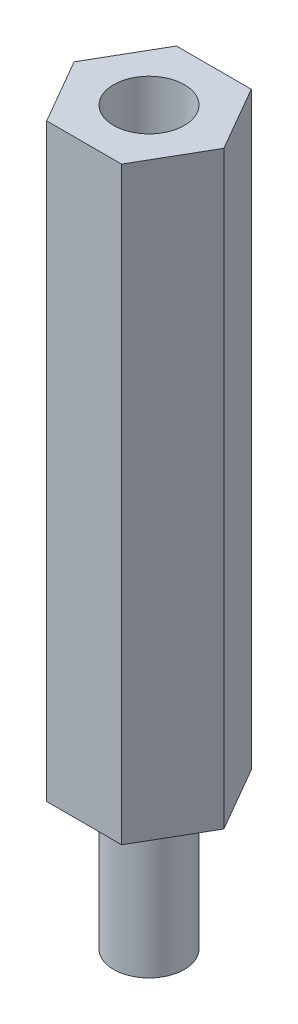
ISO-10303-21;
HEADER;
FILE_DESCRIPTION(('STEP AP214'),'2;1');
FILE_NAME('part.step','',(''),(''),'','','');
FILE_SCHEMA(('AUTOMOTIVE_DESIGN { 1 0 10303 214 1 1 1 1 }'));
ENDSEC;
DATA;
#1=APPLICATION_CONTEXT('core data for automotive mechanical design processes');
#2=APPLICATION_PROTOCOL_DEFINITION('international standard','automotive_design',2000,#1);
#3=PRODUCT_CONTEXT('',#1,'mechanical');
#4=PRODUCT('Part','Part','',(#3));
#5=PRODUCT_RELATED_PRODUCT_CATEGORY('part','',(#4));
#6=PRODUCT_DEFINITION_FORMATION('','',#4);
#7=PRODUCT_DEFINITION_CONTEXT('part definition',#1,'design');
#8=PRODUCT_DEFINITION('design','',#6,#7);
#9=PRODUCT_DEFINITION_SHAPE('','',#8);
#10=(LENGTH_UNIT() NAMED_UNIT(*) SI_UNIT(.MILLI.,.METRE.));
#11=(NAMED_UNIT(*) PLANE_ANGLE_UNIT() SI_UNIT($,.RADIAN.));
#12=(NAMED_UNIT(*) SI_UNIT($,.STERADIAN.) SOLID_ANGLE_UNIT());
#13=UNCERTAINTY_MEASURE_WITH_UNIT(LENGTH_MEASURE(1.E-05),#10,'distance_accuracy_value','');
#14=(GEOMETRIC_REPRESENTATION_CONTEXT(3) GLOBAL_UNCERTAINTY_ASSIGNED_CONTEXT((#13)) GLOBAL_UNIT_ASSIGNED_CONTEXT((#10,
#11,#12)) REPRESENTATION_CONTEXT('',''));
#15=CARTESIAN_POINT('',(0.,0.,0.));
#16=DIRECTION('',(0.,0.,1.));
#17=DIRECTION('',(1.,0.,0.));
#18=AXIS2_PLACEMENT_3D('',#15,#16,#17);
#19=CARTESIAN_POINT('',(1.58771324027146,25.,2.75000000000002));
#20=DIRECTION('',(-0.866025403784438,0.,-0.500000000000001));
#21=DIRECTION('',(-0.500000000000001,0.,0.866025403784438));
#22=AXIS2_PLACEMENT_3D('',#19,#20,#21);
#23=PLANE('',#22);
#24=DIRECTION('',(0.500000000000001,0.,-0.866025403784438));
#25=VECTOR('',#24,1.);
#26=CARTESIAN_POINT('',(1.58771324027146,0.,2.75000000000002));
#27=LINE('',#26,#25);
#28=CARTESIAN_POINT('',(1.58771324027146,0.,2.75000000000002));
#29=VERTEX_POINT('',#28);
#30=CARTESIAN_POINT('',(3.17542648054294,0.,0.));
#31=VERTEX_POINT('',#30);
#32=EDGE_CURVE('E136',#29,#31,#27,.T.);
#33=ORIENTED_EDGE('',*,*,#32,.T.);
#34=DIRECTION('',(0.,-1.,0.));
#35=VECTOR('',#34,1.);
#36=CARTESIAN_POINT('',(3.17542648054294,25.,0.));
#37=LINE('',#36,#35);
#38=CARTESIAN_POINT('',(3.17542648054294,25.,0.));
#39=VERTEX_POINT('',#38);
#40=EDGE_CURVE('E48',#39,#31,#37,.T.);
#41=ORIENTED_EDGE('',*,*,#40,.F.);
#42=DIRECTION('',(0.500000000000001,0.,-0.866025403784438));
#43=VECTOR('',#42,1.);
#44=CARTESIAN_POINT('',(1.58771324027146,25.,2.75000000000002));
#45=LINE('',#44,#43);
#46=CARTESIAN_POINT('',(1.58771324027146,25.,2.75000000000002));
#47=VERTEX_POINT('',#46);
#48=EDGE_CURVE('E153',#47,#39,#45,.T.);
#49=ORIENTED_EDGE('',*,*,#48,.F.);
#50=DIRECTION('',(0.,-1.,0.));
#51=VECTOR('',#50,1.);
#52=CARTESIAN_POINT('',(1.58771324027146,25.,2.75000000000002));
#53=LINE('',#52,#51);
#54=EDGE_CURVE('E132',#47,#29,#53,.T.);
#55=ORIENTED_EDGE('',*,*,#54,.T.);
#56=EDGE_LOOP('',(#33,#41,#49,#55));
#57=FACE_BOUND('',#56,.T.);
#58=ADVANCED_FACE('F45',(#57),#23,.F.);
#59=CARTESIAN_POINT('',(3.17542648054294,25.,0.));
#60=DIRECTION('',(-0.866025403784439,0.,0.5));
#61=DIRECTION('',(0.5,0.,0.866025403784439));
#62=AXIS2_PLACEMENT_3D('',#59,#60,#61);
#63=PLANE('',#62);
#64=DIRECTION('',(-0.5,0.,-0.866025403784439));
#65=VECTOR('',#64,1.);
#66=CARTESIAN_POINT('',(3.17542648054294,0.,0.));
#67=LINE('',#66,#65);
#68=CARTESIAN_POINT('',(1.58771324027146,0.,-2.75000000000002));
#69=VERTEX_POINT('',#68);
#70=EDGE_CURVE('E140',#31,#69,#67,.T.);
#71=ORIENTED_EDGE('',*,*,#70,.T.);
#72=DIRECTION('',(0.,-1.,0.));
#73=VECTOR('',#72,1.);
#74=CARTESIAN_POINT('',(1.58771324027146,25.,-2.75000000000002));
#75=LINE('',#74,#73);
#76=CARTESIAN_POINT('',(1.58771324027146,25.,-2.75000000000002));
#77=VERTEX_POINT('',#76);
#78=EDGE_CURVE('E159',#77,#69,#75,.T.);
#79=ORIENTED_EDGE('',*,*,#78,.F.);
#80=DIRECTION('',(-0.5,0.,-0.866025403784439));
#81=VECTOR('',#80,1.);
#82=CARTESIAN_POINT('',(3.17542648054294,25.,0.));
#83=LINE('',#82,#81);
#84=EDGE_CURVE('E101',#39,#77,#83,.T.);
#85=ORIENTED_EDGE('',*,*,#84,.F.);
#86=ORIENTED_EDGE('',*,*,#40,.T.);
#87=EDGE_LOOP('',(#71,#79,#85,#86));
#88=FACE_BOUND('',#87,.T.);
#89=ADVANCED_FACE('F166',(#88),#63,.F.);
#90=CARTESIAN_POINT('',(1.58771324027146,25.,-2.75000000000002));
#91=DIRECTION('',(0.,0.,1.));
#92=DIRECTION('',(1.,0.,0.));
#93=AXIS2_PLACEMENT_3D('',#90,#91,#92);
#94=PLANE('',#93);
#95=DIRECTION('',(-1.,0.,0.));
#96=VECTOR('',#95,1.);
#97=CARTESIAN_POINT('',(1.58771324027146,0.,-2.75000000000002));
#98=LINE('',#97,#96);
#99=CARTESIAN_POINT('',(-1.58771324027148,0.,-2.75000000000002));
#100=VERTEX_POINT('',#99);
#101=EDGE_CURVE('E144',#69,#100,#98,.T.);
#102=ORIENTED_EDGE('',*,*,#101,.T.);
#103=DIRECTION('',(0.,-1.,0.));
#104=VECTOR('',#103,1.);
#105=CARTESIAN_POINT('',(-1.58771324027148,25.,-2.75000000000002));
#106=LINE('',#105,#104);
#107=CARTESIAN_POINT('',(-1.58771324027148,25.,-2.75000000000002));
#108=VERTEX_POINT('',#107);
#109=EDGE_CURVE('E125',#108,#100,#106,.T.);
#110=ORIENTED_EDGE('',*,*,#109,.F.);
#111=DIRECTION('',(-1.,0.,0.));
#112=VECTOR('',#111,1.);
#113=CARTESIAN_POINT('',(1.58771324027146,25.,-2.75000000000002));
#114=LINE('',#113,#112);
#115=EDGE_CURVE('E114',#77,#108,#114,.T.);
#116=ORIENTED_EDGE('',*,*,#115,.F.);
#117=ORIENTED_EDGE('',*,*,#78,.T.);
#118=EDGE_LOOP('',(#102,#110,#116,#117));
#119=FACE_BOUND('',#118,.T.);
#120=ADVANCED_FACE('F172',(#119),#94,.F.);
#121=CARTESIAN_POINT('',(-1.58771324027148,25.,-2.75000000000002));
#122=DIRECTION('',(0.866025403784439,0.,0.499999999999999));
#123=DIRECTION('',(0.499999999999999,0.,-0.866025403784439));
#124=AXIS2_PLACEMENT_3D('',#121,#122,#123);
#125=PLANE('',#124);
#126=DIRECTION('',(-0.499999999999999,0.,0.866025403784439));
#127=VECTOR('',#126,1.);
#128=CARTESIAN_POINT('',(-1.58771324027148,0.,-2.75000000000002));
#129=LINE('',#128,#127);
#130=CARTESIAN_POINT('',(-3.17542648054296,0.,0.));
#131=VERTEX_POINT('',#130);
#132=EDGE_CURVE('E123',#100,#131,#129,.T.);
#133=ORIENTED_EDGE('',*,*,#132,.T.);
#134=DIRECTION('',(0.,-1.,0.));
#135=VECTOR('',#134,1.);
#136=CARTESIAN_POINT('',(-3.17542648054296,25.,0.));
#137=LINE('',#136,#135);
#138=CARTESIAN_POINT('',(-3.17542648054296,25.,0.));
#139=VERTEX_POINT('',#138);
#140=EDGE_CURVE('E120',#139,#131,#137,.T.);
#141=ORIENTED_EDGE('',*,*,#140,.F.);
#142=DIRECTION('',(-0.499999999999999,0.,0.866025403784439));
#143=VECTOR('',#142,1.);
#144=CARTESIAN_POINT('',(-1.58771324027148,25.,-2.75000000000002));
#145=LINE('',#144,#143);
#146=EDGE_CURVE('E108',#108,#139,#145,.T.);
#147=ORIENTED_EDGE('',*,*,#146,.F.);
#148=ORIENTED_EDGE('',*,*,#109,.T.);
#149=EDGE_LOOP('',(#133,#141,#147,#148));
#150=FACE_BOUND('',#149,.T.);
#151=ADVANCED_FACE('F121',(#150),#125,.F.);
#152=CARTESIAN_POINT('',(-3.17542648054296,25.,0.));
#153=DIRECTION('',(0.866025403784439,0.,-0.5));
#154=DIRECTION('',(-0.5,0.,-0.866025403784439));
#155=AXIS2_PLACEMENT_3D('',#152,#153,#154);
#156=PLANE('',#155);
#157=DIRECTION('',(0.5,0.,0.866025403784439));
#158=VECTOR('',#157,1.);
#159=CARTESIAN_POINT('',(-3.17542648054296,0.,0.));
#160=LINE('',#159,#158);
#161=CARTESIAN_POINT('',(-1.58771324027148,0.,2.75000000000002));
#162=VERTEX_POINT('',#161);
#163=EDGE_CURVE('E86',#131,#162,#160,.T.);
#164=ORIENTED_EDGE('',*,*,#163,.T.);
#165=DIRECTION('',(0.,-1.,0.));
#166=VECTOR('',#165,1.);
#167=CARTESIAN_POINT('',(-1.58771324027148,25.,2.75000000000002));
#168=LINE('',#167,#166);
#169=CARTESIAN_POINT('',(-1.58771324027148,25.,2.75000000000002));
#170=VERTEX_POINT('',#169);
#171=EDGE_CURVE('E126',#170,#162,#168,.T.);
#172=ORIENTED_EDGE('',*,*,#171,.F.);
#173=DIRECTION('',(0.5,0.,0.866025403784439));
#174=VECTOR('',#173,1.);
#175=CARTESIAN_POINT('',(-3.17542648054296,25.,0.));
#176=LINE('',#175,#174);
#177=EDGE_CURVE('E112',#139,#170,#176,.T.);
#178=ORIENTED_EDGE('',*,*,#177,.F.);
#179=ORIENTED_EDGE('',*,*,#140,.T.);
#180=EDGE_LOOP('',(#164,#172,#178,#179));
#181=FACE_BOUND('',#180,.T.);
#182=ADVANCED_FACE('F128',(#181),#156,.F.);
#183=CARTESIAN_POINT('',(-1.58771324027148,25.,2.75000000000002));
#184=DIRECTION('',(0.,0.,-1.));
#185=DIRECTION('',(-1.,0.,0.));
#186=AXIS2_PLACEMENT_3D('',#183,#184,#185);
#187=PLANE('',#186);
#188=DIRECTION('',(1.,0.,0.));
#189=VECTOR('',#188,1.);
#190=CARTESIAN_POINT('',(-1.58771324027148,0.,2.75000000000002));
#191=LINE('',#190,#189);
#192=EDGE_CURVE('E92',#162,#29,#191,.T.);
#193=ORIENTED_EDGE('',*,*,#192,.T.);
#194=ORIENTED_EDGE('',*,*,#54,.F.);
#195=DIRECTION('',(1.,0.,0.));
#196=VECTOR('',#195,1.);
#197=CARTESIAN_POINT('',(-1.58771324027148,25.,2.75000000000002));
#198=LINE('',#197,#196);
#199=EDGE_CURVE('E63',#170,#47,#198,.T.);
#200=ORIENTED_EDGE('',*,*,#199,.F.);
#201=ORIENTED_EDGE('',*,*,#171,.T.);
#202=EDGE_LOOP('',(#193,#194,#200,#201));
#203=FACE_BOUND('',#202,.T.);
#204=ADVANCED_FACE('F210',(#203),#187,.F.);
#205=CARTESIAN_POINT('',(0.,25.,0.));
#206=DIRECTION('',(0.,1.,0.));
#207=DIRECTION('',(0.,0.,1.));
#208=AXIS2_PLACEMENT_3D('',#205,#206,#207);
#209=PLANE('',#208);
#210=CARTESIAN_POINT('',(0.,25.,0.));
#211=DIRECTION('',(0.,1.,0.));
#212=DIRECTION('',(0.,0.,1.));
#213=AXIS2_PLACEMENT_3D('',#210,#211,#212);
#214=CIRCLE('',#213,1.5);
#215=CARTESIAN_POINT('',(0.,25.,1.5));
#216=VERTEX_POINT('',#215);
#217=EDGE_CURVE('E179',#216,#216,#214,.T.);
#218=ORIENTED_EDGE('',*,*,#217,.F.);
#219=EDGE_LOOP('',(#218));
#220=FACE_BOUND('',#219,.T.);
#221=ORIENTED_EDGE('',*,*,#48,.T.);
#222=ORIENTED_EDGE('',*,*,#84,.T.);
#223=ORIENTED_EDGE('',*,*,#115,.T.);
#224=ORIENTED_EDGE('',*,*,#146,.T.);
#225=ORIENTED_EDGE('',*,*,#177,.T.);
#226=ORIENTED_EDGE('',*,*,#199,.T.);
#227=EDGE_LOOP('',(#221,#222,#223,#224,#225,#226));
#228=FACE_BOUND('',#227,.T.);
#229=ADVANCED_FACE('F110',(#220,#228),#209,.T.);
#230=CARTESIAN_POINT('',(0.,0.,0.));
#231=DIRECTION('',(0.,1.,0.));
#232=DIRECTION('',(0.,0.,1.));
#233=AXIS2_PLACEMENT_3D('',#230,#231,#232);
#234=PLANE('',#233);
#235=CARTESIAN_POINT('',(0.,0.,0.));
#236=DIRECTION('',(0.,-1.,0.));
#237=DIRECTION('',(0.,0.,-1.));
#238=AXIS2_PLACEMENT_3D('',#235,#236,#237);
#239=CIRCLE('',#238,1.5);
#240=CARTESIAN_POINT('',(0.,0.,-1.5));
#241=VERTEX_POINT('',#240);
#242=EDGE_CURVE('E11',#241,#241,#239,.T.);
#243=ORIENTED_EDGE('',*,*,#242,.F.);
#244=EDGE_LOOP('',(#243));
#245=FACE_BOUND('',#244,.T.);
#246=ORIENTED_EDGE('',*,*,#32,.F.);
#247=ORIENTED_EDGE('',*,*,#192,.F.);
#248=ORIENTED_EDGE('',*,*,#163,.F.);
#249=ORIENTED_EDGE('',*,*,#132,.F.);
#250=ORIENTED_EDGE('',*,*,#101,.F.);
#251=ORIENTED_EDGE('',*,*,#70,.F.);
#252=EDGE_LOOP('',(#246,#247,#248,#249,#250,#251));
#253=FACE_BOUND('',#252,.T.);
#254=ADVANCED_FACE('F171',(#245,#253),#234,.F.);
#255=CARTESIAN_POINT('',(0.,13.,0.));
#256=DIRECTION('',(0.,1.,0.));
#257=DIRECTION('',(0.,0.,1.));
#258=AXIS2_PLACEMENT_3D('',#255,#256,#257);
#259=CYLINDRICAL_SURFACE('',#258,1.5);
#260=CARTESIAN_POINT('',(0.,13.,0.));
#261=DIRECTION('',(0.,1.,0.));
#262=DIRECTION('',(0.,0.,1.));
#263=AXIS2_PLACEMENT_3D('',#260,#261,#262);
#264=CIRCLE('',#263,1.5);
#265=CARTESIAN_POINT('',(0.,13.,1.5));
#266=VERTEX_POINT('',#265);
#267=EDGE_CURVE('E141',#266,#266,#264,.T.);
#268=ORIENTED_EDGE('',*,*,#267,.F.);
#269=EDGE_LOOP('',(#268));
#270=FACE_BOUND('',#269,.T.);
#271=ORIENTED_EDGE('',*,*,#217,.T.);
#272=EDGE_LOOP('',(#271));
#273=FACE_BOUND('',#272,.T.);
#274=ADVANCED_FACE('F201',(#270,#273),#259,.F.);
#275=CARTESIAN_POINT('',(0.,13.,0.));
#276=DIRECTION('',(0.,1.,0.));
#277=DIRECTION('',(0.,0.,1.));
#278=AXIS2_PLACEMENT_3D('',#275,#276,#277);
#279=PLANE('',#278);
#280=ORIENTED_EDGE('',*,*,#267,.T.);
#281=EDGE_LOOP('',(#280));
#282=FACE_BOUND('',#281,.T.);
#283=ADVANCED_FACE('F196',(#282),#279,.T.);
#284=CARTESIAN_POINT('',(0.,-6.,0.));
#285=DIRECTION('',(0.,1.,0.));
#286=DIRECTION('',(0.,0.,1.));
#287=AXIS2_PLACEMENT_3D('',#284,#285,#286);
#288=CYLINDRICAL_SURFACE('',#287,1.5);
#289=CARTESIAN_POINT('',(0.,-6.,0.));
#290=DIRECTION('',(0.,-1.,0.));
#291=DIRECTION('',(0.,0.,-1.));
#292=AXIS2_PLACEMENT_3D('',#289,#290,#291);
#293=CIRCLE('',#292,1.5);
#294=CARTESIAN_POINT('',(0.,-6.,-1.5));
#295=VERTEX_POINT('',#294);
#296=EDGE_CURVE('E183',#295,#295,#293,.T.);
#297=ORIENTED_EDGE('',*,*,#296,.F.);
#298=EDGE_LOOP('',(#297));
#299=FACE_BOUND('',#298,.T.);
#300=ORIENTED_EDGE('',*,*,#242,.T.);
#301=EDGE_LOOP('',(#300));
#302=FACE_BOUND('',#301,.T.);
#303=ADVANCED_FACE('F193',(#299,#302),#288,.T.);
#304=CARTESIAN_POINT('',(0.,-6.,0.));
#305=DIRECTION('',(0.,-1.,0.));
#306=DIRECTION('',(0.,0.,-1.));
#307=AXIS2_PLACEMENT_3D('',#304,#305,#306);
#308=PLANE('',#307);
#309=ORIENTED_EDGE('',*,*,#296,.T.);
#310=EDGE_LOOP('',(#309));
#311=FACE_BOUND('',#310,.T.);
#312=ADVANCED_FACE('F191',(#311),#308,.T.);
#313=CLOSED_SHELL('',(#58,#89,#120,#151,#182,#204,#229,#254,#274,#283,#303,#312));
#314=MANIFOLD_SOLID_BREP('B2',#313);
#315=ADVANCED_BREP_SHAPE_REPRESENTATION('',(#18,#314),#14);
#316=SHAPE_DEFINITION_REPRESENTATION(#9,#315);
ENDSEC;
END-ISO-10303-21;
